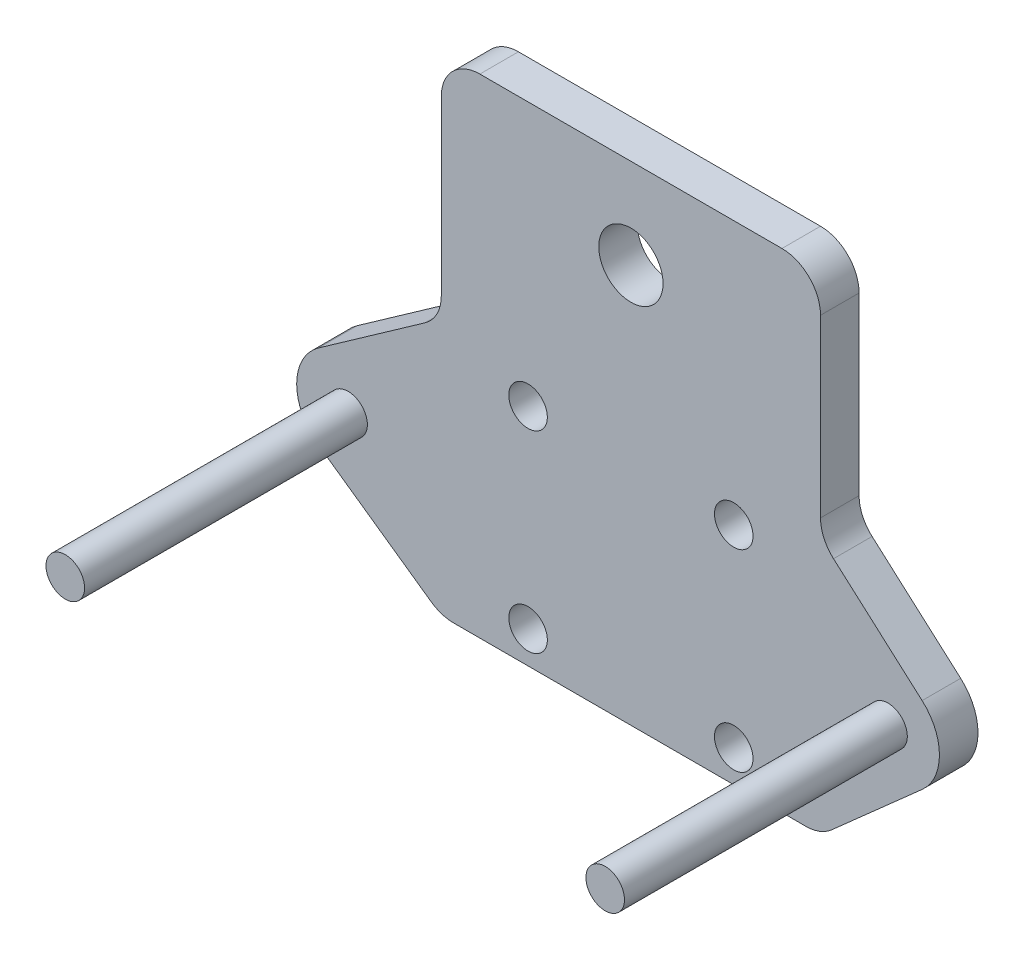
ISO-10303-21;
HEADER;
FILE_DESCRIPTION(('STEP AP214'),'2;1');
FILE_NAME('part.step','',(''),(''),'','','');
FILE_SCHEMA(('AUTOMOTIVE_DESIGN { 1 0 10303 214 1 1 1 1 }'));
ENDSEC;
DATA;
#1=APPLICATION_CONTEXT('core data for automotive mechanical design processes');
#2=APPLICATION_PROTOCOL_DEFINITION('international standard','automotive_design',2000,#1);
#3=PRODUCT_CONTEXT('',#1,'mechanical');
#4=PRODUCT('Part','Part','',(#3));
#5=PRODUCT_RELATED_PRODUCT_CATEGORY('part','',(#4));
#6=PRODUCT_DEFINITION_FORMATION('','',#4);
#7=PRODUCT_DEFINITION_CONTEXT('part definition',#1,'design');
#8=PRODUCT_DEFINITION('design','',#6,#7);
#9=PRODUCT_DEFINITION_SHAPE('','',#8);
#10=(LENGTH_UNIT() NAMED_UNIT(*) SI_UNIT(.MILLI.,.METRE.));
#11=(NAMED_UNIT(*) PLANE_ANGLE_UNIT() SI_UNIT($,.RADIAN.));
#12=(NAMED_UNIT(*) SI_UNIT($,.STERADIAN.) SOLID_ANGLE_UNIT());
#13=UNCERTAINTY_MEASURE_WITH_UNIT(LENGTH_MEASURE(1.E-05),#10,'distance_accuracy_value','');
#14=(GEOMETRIC_REPRESENTATION_CONTEXT(3) GLOBAL_UNCERTAINTY_ASSIGNED_CONTEXT((#13)) GLOBAL_UNIT_ASSIGNED_CONTEXT((#10,
#11,#12)) REPRESENTATION_CONTEXT('',''));
#15=CARTESIAN_POINT('',(0.,0.,0.));
#16=DIRECTION('',(0.,0.,1.));
#17=DIRECTION('',(1.,0.,0.));
#18=AXIS2_PLACEMENT_3D('',#15,#16,#17);
#19=CARTESIAN_POINT('',(20.,-21.,23.5));
#20=DIRECTION('',(0.,0.,-1.));
#21=DIRECTION('',(-1.,0.,0.));
#22=AXIS2_PLACEMENT_3D('',#19,#20,#21);
#23=CYLINDRICAL_SURFACE('',#22,1.5);
#24=CARTESIAN_POINT('',(20.,-21.,23.5));
#25=DIRECTION('',(0.,0.,-1.));
#26=DIRECTION('',(-1.,0.,0.));
#27=AXIS2_PLACEMENT_3D('',#24,#25,#26);
#28=CIRCLE('',#27,1.5);
#29=CARTESIAN_POINT('',(18.5,-21.,23.5));
#30=VERTEX_POINT('',#29);
#31=EDGE_CURVE('E11',#30,#30,#28,.T.);
#32=ORIENTED_EDGE('',*,*,#31,.T.);
#33=EDGE_LOOP('',(#32));
#34=FACE_BOUND('',#33,.T.);
#35=CARTESIAN_POINT('',(20.,-21.,-1.5));
#36=DIRECTION('',(0.,0.,-1.));
#37=DIRECTION('',(-1.,0.,0.));
#38=AXIS2_PLACEMENT_3D('',#35,#36,#37);
#39=CIRCLE('',#38,1.5);
#40=CARTESIAN_POINT('',(18.5,-21.,-1.5));
#41=VERTEX_POINT('',#40);
#42=EDGE_CURVE('E50',#41,#41,#39,.T.);
#43=ORIENTED_EDGE('',*,*,#42,.F.);
#44=EDGE_LOOP('',(#43));
#45=FACE_BOUND('',#44,.T.);
#46=ADVANCED_FACE('F47',(#34,#45),#23,.T.);
#47=CARTESIAN_POINT('',(20.,-21.,23.5));
#48=DIRECTION('',(0.,0.,-1.));
#49=DIRECTION('',(-1.,0.,0.));
#50=AXIS2_PLACEMENT_3D('',#47,#48,#49);
#51=PLANE('',#50);
#52=ORIENTED_EDGE('',*,*,#31,.F.);
#53=EDGE_LOOP('',(#52));
#54=FACE_BOUND('',#53,.T.);
#55=ADVANCED_FACE('F62',(#54),#51,.F.);
#56=CARTESIAN_POINT('',(20.,-21.,-1.5));
#57=DIRECTION('',(0.,0.,-1.));
#58=DIRECTION('',(-1.,0.,0.));
#59=AXIS2_PLACEMENT_3D('',#56,#57,#58);
#60=PLANE('',#59);
#61=ORIENTED_EDGE('',*,*,#42,.T.);
#62=EDGE_LOOP('',(#61));
#63=FACE_BOUND('',#62,.T.);
#64=ADVANCED_FACE('F59',(#63),#60,.T.);
#65=CLOSED_SHELL('',(#46,#55,#64));
#66=MANIFOLD_SOLID_BREP('B2',#65);
#67=CARTESIAN_POINT('',(-22.,-21.,23.5));
#68=DIRECTION('',(0.,0.,-1.));
#69=DIRECTION('',(-1.,0.,0.));
#70=AXIS2_PLACEMENT_3D('',#67,#68,#69);
#71=CYLINDRICAL_SURFACE('',#70,1.5);
#72=CARTESIAN_POINT('',(-22.,-21.,23.5));
#73=DIRECTION('',(0.,0.,-1.));
#74=DIRECTION('',(-1.,0.,0.));
#75=AXIS2_PLACEMENT_3D('',#72,#73,#74);
#76=CIRCLE('',#75,1.5);
#77=CARTESIAN_POINT('',(-23.5,-21.,23.5));
#78=VERTEX_POINT('',#77);
#79=EDGE_CURVE('E46',#78,#78,#76,.T.);
#80=ORIENTED_EDGE('',*,*,#79,.T.);
#81=EDGE_LOOP('',(#80));
#82=FACE_BOUND('',#81,.T.);
#83=CARTESIAN_POINT('',(-22.,-21.,-1.5));
#84=DIRECTION('',(0.,0.,-1.));
#85=DIRECTION('',(-1.,0.,0.));
#86=AXIS2_PLACEMENT_3D('',#83,#84,#85);
#87=CIRCLE('',#86,1.5);
#88=CARTESIAN_POINT('',(-23.5,-21.,-1.5));
#89=VERTEX_POINT('',#88);
#90=EDGE_CURVE('E99',#89,#89,#87,.T.);
#91=ORIENTED_EDGE('',*,*,#90,.F.);
#92=EDGE_LOOP('',(#91));
#93=FACE_BOUND('',#92,.T.);
#94=ADVANCED_FACE('F96',(#82,#93),#71,.T.);
#95=CARTESIAN_POINT('',(-22.,-21.,23.5));
#96=DIRECTION('',(0.,0.,-1.));
#97=DIRECTION('',(-1.,0.,0.));
#98=AXIS2_PLACEMENT_3D('',#95,#96,#97);
#99=PLANE('',#98);
#100=ORIENTED_EDGE('',*,*,#79,.F.);
#101=EDGE_LOOP('',(#100));
#102=FACE_BOUND('',#101,.T.);
#103=ADVANCED_FACE('F111',(#102),#99,.F.);
#104=CARTESIAN_POINT('',(-22.,-21.,-1.5));
#105=DIRECTION('',(0.,0.,-1.));
#106=DIRECTION('',(-1.,0.,0.));
#107=AXIS2_PLACEMENT_3D('',#104,#105,#106);
#108=PLANE('',#107);
#109=ORIENTED_EDGE('',*,*,#90,.T.);
#110=EDGE_LOOP('',(#109));
#111=FACE_BOUND('',#110,.T.);
#112=ADVANCED_FACE('F108',(#111),#108,.T.);
#113=CLOSED_SHELL('',(#94,#103,#112));
#114=MANIFOLD_SOLID_BREP('B6',#113);
#115=CARTESIAN_POINT('',(14.75,7.,1.5));
#116=DIRECTION('',(-1.,0.,0.));
#117=DIRECTION('',(0.,-1.,0.));
#118=AXIS2_PLACEMENT_3D('',#115,#116,#117);
#119=PLANE('',#118);
#120=DIRECTION('',(0.,1.,0.));
#121=VECTOR('',#120,1.);
#122=CARTESIAN_POINT('',(14.75,7.,-1.5));
#123=LINE('',#122,#121);
#124=CARTESIAN_POINT('',(14.75,-9.65044379086688,-1.5));
#125=VERTEX_POINT('',#124);
#126=CARTESIAN_POINT('',(14.75,4.,-1.5));
#127=VERTEX_POINT('',#126);
#128=EDGE_CURVE('E359',#125,#127,#123,.T.);
#129=ORIENTED_EDGE('',*,*,#128,.T.);
#130=DIRECTION('',(0.,0.,-1.));
#131=VECTOR('',#130,1.);
#132=CARTESIAN_POINT('',(14.75,4.,1.5));
#133=LINE('',#132,#131);
#134=CARTESIAN_POINT('',(14.75,4.,1.5));
#135=VERTEX_POINT('',#134);
#136=EDGE_CURVE('E378',#127,#135,#133,.F.);
#137=ORIENTED_EDGE('',*,*,#136,.T.);
#138=DIRECTION('',(0.,1.,0.));
#139=VECTOR('',#138,1.);
#140=CARTESIAN_POINT('',(14.75,7.,1.5));
#141=LINE('',#140,#139);
#142=CARTESIAN_POINT('',(14.75,-9.65044379086688,1.5));
#143=VERTEX_POINT('',#142);
#144=EDGE_CURVE('E348',#143,#135,#141,.T.);
#145=ORIENTED_EDGE('',*,*,#144,.F.);
#146=DIRECTION('',(0.,0.,1.));
#147=VECTOR('',#146,1.);
#148=CARTESIAN_POINT('',(14.75,-9.65044379086688,1.5));
#149=LINE('',#148,#147);
#150=EDGE_CURVE('E376',#143,#125,#149,.F.);
#151=ORIENTED_EDGE('',*,*,#150,.T.);
#152=EDGE_LOOP('',(#129,#137,#145,#151));
#153=FACE_BOUND('',#152,.T.);
#154=ADVANCED_FACE('F136',(#153),#119,.F.);
#155=CARTESIAN_POINT('',(0.,0.,1.5));
#156=DIRECTION('',(0.,0.,1.));
#157=DIRECTION('',(1.,0.,0.));
#158=AXIS2_PLACEMENT_3D('',#155,#156,#157);
#159=PLANE('',#158);
#160=CARTESIAN_POINT('',(8.,-28.5,1.5));
#161=DIRECTION('',(0.,0.,1.));
#162=DIRECTION('',(1.,0.,0.));
#163=AXIS2_PLACEMENT_3D('',#160,#161,#162);
#164=CIRCLE('',#163,1.5);
#165=CARTESIAN_POINT('',(9.50000000000001,-28.5,1.5));
#166=VERTEX_POINT('',#165);
#167=EDGE_CURVE('E318',#166,#166,#164,.T.);
#168=ORIENTED_EDGE('',*,*,#167,.F.);
#169=EDGE_LOOP('',(#168));
#170=FACE_BOUND('',#169,.T.);
#171=CARTESIAN_POINT('',(-7.99999999999999,-13.5,1.5));
#172=DIRECTION('',(0.,0.,1.));
#173=DIRECTION('',(1.,0.,0.));
#174=AXIS2_PLACEMENT_3D('',#171,#172,#173);
#175=CIRCLE('',#174,1.5);
#176=CARTESIAN_POINT('',(-6.5,-13.5,1.5));
#177=VERTEX_POINT('',#176);
#178=EDGE_CURVE('E330',#177,#177,#175,.T.);
#179=ORIENTED_EDGE('',*,*,#178,.F.);
#180=EDGE_LOOP('',(#179));
#181=FACE_BOUND('',#180,.T.);
#182=ORIENTED_EDGE('',*,*,#144,.T.);
#183=CARTESIAN_POINT('',(11.75,4.,1.5));
#184=DIRECTION('',(0.,0.,1.));
#185=DIRECTION('',(1.,0.,0.));
#186=AXIS2_PLACEMENT_3D('',#183,#184,#185);
#187=CIRCLE('',#186,3.);
#188=CARTESIAN_POINT('',(11.75,7.,1.5));
#189=VERTEX_POINT('',#188);
#190=EDGE_CURVE('E385',#135,#189,#187,.T.);
#191=ORIENTED_EDGE('',*,*,#190,.T.);
#192=DIRECTION('',(-1.,0.,0.));
#193=VECTOR('',#192,1.);
#194=CARTESIAN_POINT('',(-14.75,7.,1.5));
#195=LINE('',#194,#193);
#196=CARTESIAN_POINT('',(-11.75,7.,1.5));
#197=VERTEX_POINT('',#196);
#198=EDGE_CURVE('E350',#189,#197,#195,.T.);
#199=ORIENTED_EDGE('',*,*,#198,.T.);
#200=CARTESIAN_POINT('',(-11.75,4.,1.5));
#201=DIRECTION('',(0.,0.,1.));
#202=DIRECTION('',(1.,0.,0.));
#203=AXIS2_PLACEMENT_3D('',#200,#201,#202);
#204=CIRCLE('',#203,3.);
#205=CARTESIAN_POINT('',(-14.75,4.,1.5));
#206=VERTEX_POINT('',#205);
#207=EDGE_CURVE('E380',#197,#206,#204,.T.);
#208=ORIENTED_EDGE('',*,*,#207,.T.);
#209=DIRECTION('',(0.,-1.,0.));
#210=VECTOR('',#209,1.);
#211=CARTESIAN_POINT('',(-14.75,7.,1.5));
#212=LINE('',#211,#210);
#213=CARTESIAN_POINT('',(-14.75,-9.44369609921209,1.5));
#214=VERTEX_POINT('',#213);
#215=EDGE_CURVE('E342',#206,#214,#212,.T.);
#216=ORIENTED_EDGE('',*,*,#215,.T.);
#217=CARTESIAN_POINT('',(-17.75,-9.44369609921209,1.5));
#218=DIRECTION('',(0.,0.,1.));
#219=DIRECTION('',(1.,0.,0.));
#220=AXIS2_PLACEMENT_3D('',#217,#218,#219);
#221=CIRCLE('',#220,3.);
#222=CARTESIAN_POINT('',(-16.0223154328514,-11.8962674103948,1.5));
#223=VERTEX_POINT('',#222);
#224=EDGE_CURVE('E144',#214,#223,#221,.F.);
#225=ORIENTED_EDGE('',*,*,#224,.T.);
#226=DIRECTION('',(-0.817523770394244,-0.575894855716197,0.));
#227=VECTOR('',#226,1.);
#228=CARTESIAN_POINT('',(-24.3035794228648,-17.729904918423,1.5));
#229=LINE('',#228,#227);
#230=CARTESIAN_POINT('',(-24.3035794228648,-17.729904918423,1.5));
#231=VERTEX_POINT('',#230);
#232=EDGE_CURVE('E303',#223,#231,#229,.T.);
#233=ORIENTED_EDGE('',*,*,#232,.T.);
#234=CARTESIAN_POINT('',(-22.,-21.,1.5));
#235=DIRECTION('',(0.,0.,1.));
#236=DIRECTION('',(1.,0.,0.));
#237=AXIS2_PLACEMENT_3D('',#234,#235,#236);
#238=CIRCLE('',#237,4.);
#239=CARTESIAN_POINT('',(-24.3035794228648,-24.270095081577,1.5));
#240=VERTEX_POINT('',#239);
#241=EDGE_CURVE('E297',#231,#240,#238,.T.);
#242=ORIENTED_EDGE('',*,*,#241,.T.);
#243=DIRECTION('',(0.817523770394244,-0.575894855716198,0.));
#244=VECTOR('',#243,1.);
#245=CARTESIAN_POINT('',(-24.3035794228648,-24.270095081577,1.5));
#246=LINE('',#245,#244);
#247=CARTESIAN_POINT('',(-15.5271140187514,-30.4525713111827,1.5));
#248=VERTEX_POINT('',#247);
#249=EDGE_CURVE('E300',#240,#248,#246,.T.);
#250=ORIENTED_EDGE('',*,*,#249,.T.);
#251=CARTESIAN_POINT('',(-13.7994294516028,-28.,1.5));
#252=DIRECTION('',(0.,0.,1.));
#253=DIRECTION('',(1.,0.,0.));
#254=AXIS2_PLACEMENT_3D('',#251,#252,#253);
#255=CIRCLE('',#254,3.);
#256=CARTESIAN_POINT('',(-13.7994294516028,-31.,1.5));
#257=VERTEX_POINT('',#256);
#258=EDGE_CURVE('E382',#248,#257,#255,.T.);
#259=ORIENTED_EDGE('',*,*,#258,.T.);
#260=DIRECTION('',(1.,0.,0.));
#261=VECTOR('',#260,1.);
#262=CARTESIAN_POINT('',(-14.75,-31.,1.5));
#263=LINE('',#262,#261);
#264=CARTESIAN_POINT('',(13.6116467670417,-31.,1.5));
#265=VERTEX_POINT('',#264);
#266=EDGE_CURVE('E345',#257,#265,#263,.T.);
#267=ORIENTED_EDGE('',*,*,#266,.T.);
#268=CARTESIAN_POINT('',(13.6116467670417,-28.,1.5));
#269=DIRECTION('',(0.,0.,1.));
#270=DIRECTION('',(1.,0.,0.));
#271=AXIS2_PLACEMENT_3D('',#268,#269,#270);
#272=CIRCLE('',#271,3.);
#273=CARTESIAN_POINT('',(15.6018041613712,-30.244832632023,1.5));
#274=VERTEX_POINT('',#273);
#275=EDGE_CURVE('E159',#265,#274,#272,.T.);
#276=ORIENTED_EDGE('',*,*,#275,.T.);
#277=DIRECTION('',(0.748277544007673,0.663385798109852,0.));
#278=VECTOR('',#277,1.);
#279=CARTESIAN_POINT('',(22.6535431924394,-23.9931101760307,1.5));
#280=LINE('',#279,#278);
#281=CARTESIAN_POINT('',(22.6535431924394,-23.9931101760307,1.5));
#282=VERTEX_POINT('',#281);
#283=EDGE_CURVE('E261',#274,#282,#280,.T.);
#284=ORIENTED_EDGE('',*,*,#283,.T.);
#285=CARTESIAN_POINT('',(20.,-21.,1.5));
#286=DIRECTION('',(0.,0.,1.));
#287=DIRECTION('',(1.,0.,0.));
#288=AXIS2_PLACEMENT_3D('',#285,#286,#287);
#289=CIRCLE('',#288,4.);
#290=CARTESIAN_POINT('',(22.6535431924394,-18.0068898239693,1.5));
#291=VERTEX_POINT('',#290);
#292=EDGE_CURVE('E256',#282,#291,#289,.T.);
#293=ORIENTED_EDGE('',*,*,#292,.T.);
#294=DIRECTION('',(-0.748277544007673,0.663385798109852,0.));
#295=VECTOR('',#294,1.);
#296=CARTESIAN_POINT('',(22.6535431924394,-18.0068898239693,1.5));
#297=LINE('',#296,#295);
#298=CARTESIAN_POINT('',(15.7598426056704,-11.8952764228899,1.5));
#299=VERTEX_POINT('',#298);
#300=EDGE_CURVE('E264',#291,#299,#297,.T.);
#301=ORIENTED_EDGE('',*,*,#300,.T.);
#302=CARTESIAN_POINT('',(17.75,-9.65044379086688,1.5));
#303=DIRECTION('',(0.,0.,1.));
#304=DIRECTION('',(1.,0.,0.));
#305=AXIS2_PLACEMENT_3D('',#302,#303,#304);
#306=CIRCLE('',#305,3.);
#307=EDGE_CURVE('E151',#299,#143,#306,.F.);
#308=ORIENTED_EDGE('',*,*,#307,.T.);
#309=EDGE_LOOP('',(#182,#191,#199,#208,#216,#225,#233,#242,#250,#259,#267,#276,#284,#293,#301,#308));
#310=FACE_BOUND('',#309,.T.);
#311=CARTESIAN_POINT('',(0.,0.,1.5));
#312=DIRECTION('',(0.,0.,1.));
#313=DIRECTION('',(1.,0.,0.));
#314=AXIS2_PLACEMENT_3D('',#311,#312,#313);
#315=CIRCLE('',#314,2.5);
#316=CARTESIAN_POINT('',(2.5,0.,1.5));
#317=VERTEX_POINT('',#316);
#318=EDGE_CURVE('E336',#317,#317,#315,.T.);
#319=ORIENTED_EDGE('',*,*,#318,.F.);
#320=EDGE_LOOP('',(#319));
#321=FACE_BOUND('',#320,.T.);
#322=CARTESIAN_POINT('',(8.00000000000001,-13.5,1.5));
#323=DIRECTION('',(0.,0.,1.));
#324=DIRECTION('',(1.,0.,0.));
#325=AXIS2_PLACEMENT_3D('',#322,#323,#324);
#326=CIRCLE('',#325,1.5);
#327=CARTESIAN_POINT('',(9.50000000000001,-13.5,1.5));
#328=VERTEX_POINT('',#327);
#329=EDGE_CURVE('E324',#328,#328,#326,.T.);
#330=ORIENTED_EDGE('',*,*,#329,.F.);
#331=EDGE_LOOP('',(#330));
#332=FACE_BOUND('',#331,.T.);
#333=CARTESIAN_POINT('',(-8.,-28.5,1.5));
#334=DIRECTION('',(0.,0.,1.));
#335=DIRECTION('',(1.,0.,0.));
#336=AXIS2_PLACEMENT_3D('',#333,#334,#335);
#337=CIRCLE('',#336,1.5);
#338=CARTESIAN_POINT('',(-6.5,-28.5,1.5));
#339=VERTEX_POINT('',#338);
#340=EDGE_CURVE('E312',#339,#339,#337,.T.);
#341=ORIENTED_EDGE('',*,*,#340,.F.);
#342=EDGE_LOOP('',(#341));
#343=FACE_BOUND('',#342,.T.);
#344=CARTESIAN_POINT('',(-22.,-21.,1.5));
#345=DIRECTION('',(0.,0.,1.));
#346=DIRECTION('',(1.,0.,0.));
#347=AXIS2_PLACEMENT_3D('',#344,#345,#346);
#348=CIRCLE('',#347,1.5);
#349=CARTESIAN_POINT('',(-20.5,-21.,1.5));
#350=VERTEX_POINT('',#349);
#351=EDGE_CURVE('E284',#350,#350,#348,.T.);
#352=ORIENTED_EDGE('',*,*,#351,.F.);
#353=EDGE_LOOP('',(#352));
#354=FACE_BOUND('',#353,.T.);
#355=CARTESIAN_POINT('',(20.,-21.,1.5));
#356=DIRECTION('',(0.,0.,1.));
#357=DIRECTION('',(1.,0.,0.));
#358=AXIS2_PLACEMENT_3D('',#355,#356,#357);
#359=CIRCLE('',#358,1.5);
#360=CARTESIAN_POINT('',(21.5,-21.,1.5));
#361=VERTEX_POINT('',#360);
#362=EDGE_CURVE('E272',#361,#361,#359,.T.);
#363=ORIENTED_EDGE('',*,*,#362,.F.);
#364=EDGE_LOOP('',(#363));
#365=FACE_BOUND('',#364,.T.);
#366=ADVANCED_FACE('F269',(#170,#181,#310,#321,#332,#343,#354,#365),#159,.T.);
#367=CARTESIAN_POINT('',(0.,0.,-1.5));
#368=DIRECTION('',(0.,0.,1.));
#369=DIRECTION('',(1.,0.,0.));
#370=AXIS2_PLACEMENT_3D('',#367,#368,#369);
#371=PLANE('',#370);
#372=DIRECTION('',(-1.,0.,0.));
#373=VECTOR('',#372,1.);
#374=CARTESIAN_POINT('',(-14.75,7.,-1.5));
#375=LINE('',#374,#373);
#376=CARTESIAN_POINT('',(11.75,7.,-1.5));
#377=VERTEX_POINT('',#376);
#378=CARTESIAN_POINT('',(-11.75,7.,-1.5));
#379=VERTEX_POINT('',#378);
#380=EDGE_CURVE('E346',#377,#379,#375,.T.);
#381=ORIENTED_EDGE('',*,*,#380,.F.);
#382=CARTESIAN_POINT('',(11.75,4.,-1.5));
#383=DIRECTION('',(0.,0.,1.));
#384=DIRECTION('',(1.,0.,0.));
#385=AXIS2_PLACEMENT_3D('',#382,#383,#384);
#386=CIRCLE('',#385,3.);
#387=EDGE_CURVE('E374',#377,#127,#386,.F.);
#388=ORIENTED_EDGE('',*,*,#387,.T.);
#389=ORIENTED_EDGE('',*,*,#128,.F.);
#390=CARTESIAN_POINT('',(17.75,-9.65044379086688,-1.5));
#391=DIRECTION('',(0.,0.,1.));
#392=DIRECTION('',(1.,0.,0.));
#393=AXIS2_PLACEMENT_3D('',#390,#391,#392);
#394=CIRCLE('',#393,3.);
#395=CARTESIAN_POINT('',(15.7598426056704,-11.8952764228899,-1.5));
#396=VERTEX_POINT('',#395);
#397=EDGE_CURVE('E407',#125,#396,#394,.T.);
#398=ORIENTED_EDGE('',*,*,#397,.T.);
#399=DIRECTION('',(0.748277544007673,-0.663385798109852,0.));
#400=VECTOR('',#399,1.);
#401=CARTESIAN_POINT('',(22.6535431924394,-18.0068898239693,-1.5));
#402=LINE('',#401,#400);
#403=CARTESIAN_POINT('',(22.6535431924394,-18.0068898239693,-1.5));
#404=VERTEX_POINT('',#403);
#405=EDGE_CURVE('E285',#396,#404,#402,.T.);
#406=ORIENTED_EDGE('',*,*,#405,.T.);
#407=CARTESIAN_POINT('',(20.,-21.,-1.5));
#408=DIRECTION('',(0.,0.,1.));
#409=DIRECTION('',(1.,0.,0.));
#410=AXIS2_PLACEMENT_3D('',#407,#408,#409);
#411=CIRCLE('',#410,4.);
#412=CARTESIAN_POINT('',(22.6535431924394,-23.9931101760307,-1.5));
#413=VERTEX_POINT('',#412);
#414=EDGE_CURVE('E257',#404,#413,#411,.F.);
#415=ORIENTED_EDGE('',*,*,#414,.T.);
#416=DIRECTION('',(-0.748277544007673,-0.663385798109852,0.));
#417=VECTOR('',#416,1.);
#418=CARTESIAN_POINT('',(22.6535431924394,-23.9931101760307,-1.5));
#419=LINE('',#418,#417);
#420=CARTESIAN_POINT('',(15.6018041613712,-30.244832632023,-1.5));
#421=VERTEX_POINT('',#420);
#422=EDGE_CURVE('E279',#413,#421,#419,.T.);
#423=ORIENTED_EDGE('',*,*,#422,.T.);
#424=CARTESIAN_POINT('',(13.6116467670417,-28.,-1.5));
#425=DIRECTION('',(0.,0.,1.));
#426=DIRECTION('',(1.,0.,0.));
#427=AXIS2_PLACEMENT_3D('',#424,#425,#426);
#428=CIRCLE('',#427,3.);
#429=CARTESIAN_POINT('',(13.6116467670417,-31.,-1.5));
#430=VERTEX_POINT('',#429);
#431=EDGE_CURVE('E372',#421,#430,#428,.F.);
#432=ORIENTED_EDGE('',*,*,#431,.T.);
#433=DIRECTION('',(1.,0.,0.));
#434=VECTOR('',#433,1.);
#435=CARTESIAN_POINT('',(-14.75,-31.,-1.5));
#436=LINE('',#435,#434);
#437=CARTESIAN_POINT('',(-13.7994294516028,-31.,-1.5));
#438=VERTEX_POINT('',#437);
#439=EDGE_CURVE('E356',#438,#430,#436,.T.);
#440=ORIENTED_EDGE('',*,*,#439,.F.);
#441=CARTESIAN_POINT('',(-13.7994294516028,-28.,-1.5));
#442=DIRECTION('',(0.,0.,1.));
#443=DIRECTION('',(1.,0.,0.));
#444=AXIS2_PLACEMENT_3D('',#441,#442,#443);
#445=CIRCLE('',#444,3.);
#446=CARTESIAN_POINT('',(-15.5271140187514,-30.4525713111827,-1.5));
#447=VERTEX_POINT('',#446);
#448=EDGE_CURVE('E370',#438,#447,#445,.F.);
#449=ORIENTED_EDGE('',*,*,#448,.T.);
#450=DIRECTION('',(-0.817523770394244,0.575894855716198,0.));
#451=VECTOR('',#450,1.);
#452=CARTESIAN_POINT('',(-24.3035794228648,-24.270095081577,-1.5));
#453=LINE('',#452,#451);
#454=CARTESIAN_POINT('',(-24.3035794228648,-24.270095081577,-1.5));
#455=VERTEX_POINT('',#454);
#456=EDGE_CURVE('E286',#447,#455,#453,.T.);
#457=ORIENTED_EDGE('',*,*,#456,.T.);
#458=CARTESIAN_POINT('',(-22.,-21.,-1.5));
#459=DIRECTION('',(0.,0.,1.));
#460=DIRECTION('',(1.,0.,0.));
#461=AXIS2_PLACEMENT_3D('',#458,#459,#460);
#462=CIRCLE('',#461,4.);
#463=CARTESIAN_POINT('',(-24.3035794228648,-17.729904918423,-1.5));
#464=VERTEX_POINT('',#463);
#465=EDGE_CURVE('E289',#455,#464,#462,.F.);
#466=ORIENTED_EDGE('',*,*,#465,.T.);
#467=DIRECTION('',(0.817523770394244,0.575894855716197,0.));
#468=VECTOR('',#467,1.);
#469=CARTESIAN_POINT('',(-24.3035794228648,-17.729904918423,-1.5));
#470=LINE('',#469,#468);
#471=CARTESIAN_POINT('',(-16.0223154328514,-11.8962674103948,-1.5));
#472=VERTEX_POINT('',#471);
#473=EDGE_CURVE('E290',#464,#472,#470,.T.);
#474=ORIENTED_EDGE('',*,*,#473,.T.);
#475=CARTESIAN_POINT('',(-17.75,-9.44369609921209,-1.5));
#476=DIRECTION('',(0.,0.,1.));
#477=DIRECTION('',(1.,0.,0.));
#478=AXIS2_PLACEMENT_3D('',#475,#476,#477);
#479=CIRCLE('',#478,3.);
#480=CARTESIAN_POINT('',(-14.75,-9.44369609921209,-1.5));
#481=VERTEX_POINT('',#480);
#482=EDGE_CURVE('E94',#472,#481,#479,.T.);
#483=ORIENTED_EDGE('',*,*,#482,.T.);
#484=DIRECTION('',(0.,-1.,0.));
#485=VECTOR('',#484,1.);
#486=CARTESIAN_POINT('',(-14.75,7.,-1.5));
#487=LINE('',#486,#485);
#488=CARTESIAN_POINT('',(-14.75,4.,-1.5));
#489=VERTEX_POINT('',#488);
#490=EDGE_CURVE('E339',#489,#481,#487,.T.);
#491=ORIENTED_EDGE('',*,*,#490,.F.);
#492=CARTESIAN_POINT('',(-11.75,4.,-1.5));
#493=DIRECTION('',(0.,0.,1.));
#494=DIRECTION('',(1.,0.,0.));
#495=AXIS2_PLACEMENT_3D('',#492,#493,#494);
#496=CIRCLE('',#495,3.);
#497=EDGE_CURVE('E368',#489,#379,#496,.F.);
#498=ORIENTED_EDGE('',*,*,#497,.T.);
#499=EDGE_LOOP('',(#381,#388,#389,#398,#406,#415,#423,#432,#440,#449,#457,#466,#474,#483,#491,#498));
#500=FACE_BOUND('',#499,.T.);
#501=CARTESIAN_POINT('',(0.,0.,-1.5));
#502=DIRECTION('',(0.,0.,1.));
#503=DIRECTION('',(1.,0.,0.));
#504=AXIS2_PLACEMENT_3D('',#501,#502,#503);
#505=CIRCLE('',#504,2.5);
#506=CARTESIAN_POINT('',(2.5,0.,-1.5));
#507=VERTEX_POINT('',#506);
#508=EDGE_CURVE('E333',#507,#507,#505,.T.);
#509=ORIENTED_EDGE('',*,*,#508,.T.);
#510=EDGE_LOOP('',(#509));
#511=FACE_BOUND('',#510,.T.);
#512=CARTESIAN_POINT('',(-7.99999999999999,-13.5,-1.5));
#513=DIRECTION('',(0.,0.,1.));
#514=DIRECTION('',(1.,0.,0.));
#515=AXIS2_PLACEMENT_3D('',#512,#513,#514);
#516=CIRCLE('',#515,1.5);
#517=CARTESIAN_POINT('',(-6.5,-13.5,-1.5));
#518=VERTEX_POINT('',#517);
#519=EDGE_CURVE('E327',#518,#518,#516,.T.);
#520=ORIENTED_EDGE('',*,*,#519,.T.);
#521=EDGE_LOOP('',(#520));
#522=FACE_BOUND('',#521,.T.);
#523=CARTESIAN_POINT('',(8.00000000000001,-13.5,-1.5));
#524=DIRECTION('',(0.,0.,1.));
#525=DIRECTION('',(1.,0.,0.));
#526=AXIS2_PLACEMENT_3D('',#523,#524,#525);
#527=CIRCLE('',#526,1.5);
#528=CARTESIAN_POINT('',(9.50000000000001,-13.5,-1.5));
#529=VERTEX_POINT('',#528);
#530=EDGE_CURVE('E321',#529,#529,#527,.T.);
#531=ORIENTED_EDGE('',*,*,#530,.T.);
#532=EDGE_LOOP('',(#531));
#533=FACE_BOUND('',#532,.T.);
#534=CARTESIAN_POINT('',(8.,-28.5,-1.5));
#535=DIRECTION('',(0.,0.,1.));
#536=DIRECTION('',(1.,0.,0.));
#537=AXIS2_PLACEMENT_3D('',#534,#535,#536);
#538=CIRCLE('',#537,1.5);
#539=CARTESIAN_POINT('',(9.50000000000001,-28.5,-1.5));
#540=VERTEX_POINT('',#539);
#541=EDGE_CURVE('E315',#540,#540,#538,.T.);
#542=ORIENTED_EDGE('',*,*,#541,.T.);
#543=EDGE_LOOP('',(#542));
#544=FACE_BOUND('',#543,.T.);
#545=CARTESIAN_POINT('',(-8.,-28.5,-1.5));
#546=DIRECTION('',(0.,0.,1.));
#547=DIRECTION('',(1.,0.,0.));
#548=AXIS2_PLACEMENT_3D('',#545,#546,#547);
#549=CIRCLE('',#548,1.5);
#550=CARTESIAN_POINT('',(-6.5,-28.5,-1.5));
#551=VERTEX_POINT('',#550);
#552=EDGE_CURVE('E311',#551,#551,#549,.T.);
#553=ORIENTED_EDGE('',*,*,#552,.T.);
#554=EDGE_LOOP('',(#553));
#555=FACE_BOUND('',#554,.T.);
#556=CARTESIAN_POINT('',(-22.,-21.,-1.5));
#557=DIRECTION('',(0.,0.,1.));
#558=DIRECTION('',(1.,0.,0.));
#559=AXIS2_PLACEMENT_3D('',#556,#557,#558);
#560=CIRCLE('',#559,1.5);
#561=CARTESIAN_POINT('',(-20.5,-21.,-1.5));
#562=VERTEX_POINT('',#561);
#563=EDGE_CURVE('E288',#562,#562,#560,.F.);
#564=ORIENTED_EDGE('',*,*,#563,.F.);
#565=EDGE_LOOP('',(#564));
#566=FACE_BOUND('',#565,.T.);
#567=CARTESIAN_POINT('',(20.,-21.,-1.5));
#568=DIRECTION('',(0.,0.,1.));
#569=DIRECTION('',(1.,0.,0.));
#570=AXIS2_PLACEMENT_3D('',#567,#568,#569);
#571=CIRCLE('',#570,1.5);
#572=CARTESIAN_POINT('',(21.5,-21.,-1.5));
#573=VERTEX_POINT('',#572);
#574=EDGE_CURVE('E281',#573,#573,#571,.F.);
#575=ORIENTED_EDGE('',*,*,#574,.F.);
#576=EDGE_LOOP('',(#575));
#577=FACE_BOUND('',#576,.T.);
#578=ADVANCED_FACE('F423',(#500,#511,#522,#533,#544,#555,#566,#577),#371,.F.);
#579=CARTESIAN_POINT('',(-14.75,7.,1.5));
#580=DIRECTION('',(1.,0.,0.));
#581=DIRECTION('',(0.,1.,0.));
#582=AXIS2_PLACEMENT_3D('',#579,#580,#581);
#583=PLANE('',#582);
#584=ORIENTED_EDGE('',*,*,#490,.T.);
#585=DIRECTION('',(0.,0.,1.));
#586=VECTOR('',#585,1.);
#587=CARTESIAN_POINT('',(-14.75,-9.44369609921209,1.5));
#588=LINE('',#587,#586);
#589=EDGE_CURVE('E401',#481,#214,#588,.T.);
#590=ORIENTED_EDGE('',*,*,#589,.T.);
#591=ORIENTED_EDGE('',*,*,#215,.F.);
#592=DIRECTION('',(0.,0.,-1.));
#593=VECTOR('',#592,1.);
#594=CARTESIAN_POINT('',(-14.75,4.,1.5));
#595=LINE('',#594,#593);
#596=EDGE_CURVE('E398',#206,#489,#595,.T.);
#597=ORIENTED_EDGE('',*,*,#596,.T.);
#598=EDGE_LOOP('',(#584,#590,#591,#597));
#599=FACE_BOUND('',#598,.T.);
#600=ADVANCED_FACE('F426',(#599),#583,.F.);
#601=CARTESIAN_POINT('',(-14.75,-31.,1.5));
#602=DIRECTION('',(0.,1.,0.));
#603=DIRECTION('',(-1.,0.,0.));
#604=AXIS2_PLACEMENT_3D('',#601,#602,#603);
#605=PLANE('',#604);
#606=ORIENTED_EDGE('',*,*,#439,.T.);
#607=DIRECTION('',(0.,0.,-1.));
#608=VECTOR('',#607,1.);
#609=CARTESIAN_POINT('',(13.6116467670417,-31.,1.5));
#610=LINE('',#609,#608);
#611=EDGE_CURVE('E394',#430,#265,#610,.F.);
#612=ORIENTED_EDGE('',*,*,#611,.T.);
#613=ORIENTED_EDGE('',*,*,#266,.F.);
#614=DIRECTION('',(0.,0.,-1.));
#615=VECTOR('',#614,1.);
#616=CARTESIAN_POINT('',(-13.7994294516028,-31.,-1.5));
#617=LINE('',#616,#615);
#618=EDGE_CURVE('E391',#257,#438,#617,.T.);
#619=ORIENTED_EDGE('',*,*,#618,.T.);
#620=EDGE_LOOP('',(#606,#612,#613,#619));
#621=FACE_BOUND('',#620,.T.);
#622=ADVANCED_FACE('F457',(#621),#605,.F.);
#623=CARTESIAN_POINT('',(-14.75,7.,1.5));
#624=DIRECTION('',(0.,-1.,0.));
#625=DIRECTION('',(1.,0.,0.));
#626=AXIS2_PLACEMENT_3D('',#623,#624,#625);
#627=PLANE('',#626);
#628=ORIENTED_EDGE('',*,*,#198,.F.);
#629=DIRECTION('',(0.,0.,-1.));
#630=VECTOR('',#629,1.);
#631=CARTESIAN_POINT('',(11.75,7.,1.5));
#632=LINE('',#631,#630);
#633=EDGE_CURVE('E365',#189,#377,#632,.T.);
#634=ORIENTED_EDGE('',*,*,#633,.T.);
#635=ORIENTED_EDGE('',*,*,#380,.T.);
#636=DIRECTION('',(0.,0.,-1.));
#637=VECTOR('',#636,1.);
#638=CARTESIAN_POINT('',(-11.75,7.,1.5));
#639=LINE('',#638,#637);
#640=EDGE_CURVE('E353',#379,#197,#639,.F.);
#641=ORIENTED_EDGE('',*,*,#640,.T.);
#642=EDGE_LOOP('',(#628,#634,#635,#641));
#643=FACE_BOUND('',#642,.T.);
#644=ADVANCED_FACE('F433',(#643),#627,.F.);
#645=CARTESIAN_POINT('',(0.,0.,1.5));
#646=DIRECTION('',(0.,0.,-1.));
#647=DIRECTION('',(-1.,0.,0.));
#648=AXIS2_PLACEMENT_3D('',#645,#646,#647);
#649=CYLINDRICAL_SURFACE('',#648,2.5);
#650=ORIENTED_EDGE('',*,*,#318,.T.);
#651=EDGE_LOOP('',(#650));
#652=FACE_BOUND('',#651,.T.);
#653=ORIENTED_EDGE('',*,*,#508,.F.);
#654=EDGE_LOOP('',(#653));
#655=FACE_BOUND('',#654,.T.);
#656=ADVANCED_FACE('F586',(#652,#655),#649,.F.);
#657=CARTESIAN_POINT('',(-7.99999999999999,-13.5,1.5));
#658=DIRECTION('',(0.,0.,-1.));
#659=DIRECTION('',(-1.,0.,0.));
#660=AXIS2_PLACEMENT_3D('',#657,#658,#659);
#661=CYLINDRICAL_SURFACE('',#660,1.5);
#662=ORIENTED_EDGE('',*,*,#178,.T.);
#663=EDGE_LOOP('',(#662));
#664=FACE_BOUND('',#663,.T.);
#665=ORIENTED_EDGE('',*,*,#519,.F.);
#666=EDGE_LOOP('',(#665));
#667=FACE_BOUND('',#666,.T.);
#668=ADVANCED_FACE('F666',(#664,#667),#661,.F.);
#669=CARTESIAN_POINT('',(8.00000000000001,-13.5,1.5));
#670=DIRECTION('',(0.,0.,-1.));
#671=DIRECTION('',(-1.,0.,0.));
#672=AXIS2_PLACEMENT_3D('',#669,#670,#671);
#673=CYLINDRICAL_SURFACE('',#672,1.5);
#674=ORIENTED_EDGE('',*,*,#329,.T.);
#675=EDGE_LOOP('',(#674));
#676=FACE_BOUND('',#675,.T.);
#677=ORIENTED_EDGE('',*,*,#530,.F.);
#678=EDGE_LOOP('',(#677));
#679=FACE_BOUND('',#678,.T.);
#680=ADVANCED_FACE('F656',(#676,#679),#673,.F.);
#681=CARTESIAN_POINT('',(8.,-28.5,1.5));
#682=DIRECTION('',(0.,0.,-1.));
#683=DIRECTION('',(-1.,0.,0.));
#684=AXIS2_PLACEMENT_3D('',#681,#682,#683);
#685=CYLINDRICAL_SURFACE('',#684,1.5);
#686=ORIENTED_EDGE('',*,*,#167,.T.);
#687=EDGE_LOOP('',(#686));
#688=FACE_BOUND('',#687,.T.);
#689=ORIENTED_EDGE('',*,*,#541,.F.);
#690=EDGE_LOOP('',(#689));
#691=FACE_BOUND('',#690,.T.);
#692=ADVANCED_FACE('F647',(#688,#691),#685,.F.);
#693=CARTESIAN_POINT('',(-8.,-28.5,1.5));
#694=DIRECTION('',(0.,0.,-1.));
#695=DIRECTION('',(-1.,0.,0.));
#696=AXIS2_PLACEMENT_3D('',#693,#694,#695);
#697=CYLINDRICAL_SURFACE('',#696,1.5);
#698=ORIENTED_EDGE('',*,*,#340,.T.);
#699=EDGE_LOOP('',(#698));
#700=FACE_BOUND('',#699,.T.);
#701=ORIENTED_EDGE('',*,*,#552,.F.);
#702=EDGE_LOOP('',(#701));
#703=FACE_BOUND('',#702,.T.);
#704=ADVANCED_FACE('F576',(#700,#703),#697,.F.);
#705=CARTESIAN_POINT('',(-24.3035794228648,-24.270095081577,-24.4469496883573));
#706=DIRECTION('',(-0.575894855716198,-0.817523770394244,0.));
#707=DIRECTION('',(0.817523770394244,-0.575894855716198,0.));
#708=AXIS2_PLACEMENT_3D('',#705,#706,#707);
#709=PLANE('',#708);
#710=ORIENTED_EDGE('',*,*,#456,.F.);
#711=DIRECTION('',(0.,0.,-1.));
#712=VECTOR('',#711,1.);
#713=CARTESIAN_POINT('',(-15.5271140187514,-30.4525713111827,1.5));
#714=LINE('',#713,#712);
#715=EDGE_CURVE('E396',#447,#248,#714,.F.);
#716=ORIENTED_EDGE('',*,*,#715,.T.);
#717=ORIENTED_EDGE('',*,*,#249,.F.);
#718=DIRECTION('',(0.,0.,1.));
#719=VECTOR('',#718,1.);
#720=CARTESIAN_POINT('',(-24.3035794228648,-24.270095081577,-24.4469496883573));
#721=LINE('',#720,#719);
#722=EDGE_CURVE('E305',#455,#240,#721,.T.);
#723=ORIENTED_EDGE('',*,*,#722,.F.);
#724=EDGE_LOOP('',(#710,#716,#717,#723));
#725=FACE_BOUND('',#724,.T.);
#726=ADVANCED_FACE('F468',(#725),#709,.T.);
#727=CARTESIAN_POINT('',(-24.3035794228648,-17.729904918423,-24.4469496883573));
#728=DIRECTION('',(-0.575894855716197,0.817523770394244,0.));
#729=DIRECTION('',(-0.817523770394244,-0.575894855716197,0.));
#730=AXIS2_PLACEMENT_3D('',#727,#728,#729);
#731=PLANE('',#730);
#732=ORIENTED_EDGE('',*,*,#232,.F.);
#733=DIRECTION('',(0.,0.,1.));
#734=VECTOR('',#733,1.);
#735=CARTESIAN_POINT('',(-16.0223154328514,-11.8962674103948,-24.4469496883573));
#736=LINE('',#735,#734);
#737=EDGE_CURVE('E404',#223,#472,#736,.F.);
#738=ORIENTED_EDGE('',*,*,#737,.T.);
#739=ORIENTED_EDGE('',*,*,#473,.F.);
#740=DIRECTION('',(0.,0.,1.));
#741=VECTOR('',#740,1.);
#742=CARTESIAN_POINT('',(-24.3035794228648,-17.729904918423,-24.4469496883573));
#743=LINE('',#742,#741);
#744=EDGE_CURVE('E293',#464,#231,#743,.T.);
#745=ORIENTED_EDGE('',*,*,#744,.T.);
#746=EDGE_LOOP('',(#732,#738,#739,#745));
#747=FACE_BOUND('',#746,.T.);
#748=ADVANCED_FACE('F414',(#747),#731,.T.);
#749=CARTESIAN_POINT('',(-22.,-21.,-24.4469496883573));
#750=DIRECTION('',(0.,0.,1.));
#751=DIRECTION('',(1.,0.,0.));
#752=AXIS2_PLACEMENT_3D('',#749,#750,#751);
#753=CYLINDRICAL_SURFACE('',#752,4.);
#754=ORIENTED_EDGE('',*,*,#465,.F.);
#755=ORIENTED_EDGE('',*,*,#722,.T.);
#756=ORIENTED_EDGE('',*,*,#241,.F.);
#757=ORIENTED_EDGE('',*,*,#744,.F.);
#758=EDGE_LOOP('',(#754,#755,#756,#757));
#759=FACE_BOUND('',#758,.T.);
#760=ADVANCED_FACE('F470',(#759),#753,.T.);
#761=CARTESIAN_POINT('',(-22.,-21.,-24.4469496883573));
#762=DIRECTION('',(0.,0.,1.));
#763=DIRECTION('',(1.,0.,0.));
#764=AXIS2_PLACEMENT_3D('',#761,#762,#763);
#765=CYLINDRICAL_SURFACE('',#764,1.5);
#766=ORIENTED_EDGE('',*,*,#563,.T.);
#767=EDGE_LOOP('',(#766));
#768=FACE_BOUND('',#767,.T.);
#769=ORIENTED_EDGE('',*,*,#351,.T.);
#770=EDGE_LOOP('',(#769));
#771=FACE_BOUND('',#770,.T.);
#772=ADVANCED_FACE('F472',(#768,#771),#765,.F.);
#773=CARTESIAN_POINT('',(22.6535431924394,-18.0068898239693,-24.4469496883573));
#774=DIRECTION('',(0.663385798109852,0.748277544007673,0.));
#775=DIRECTION('',(-0.748277544007673,0.663385798109852,0.));
#776=AXIS2_PLACEMENT_3D('',#773,#774,#775);
#777=PLANE('',#776);
#778=ORIENTED_EDGE('',*,*,#405,.F.);
#779=DIRECTION('',(0.,0.,1.));
#780=VECTOR('',#779,1.);
#781=CARTESIAN_POINT('',(15.7598426056704,-11.8952764228899,-24.4469496883573));
#782=LINE('',#781,#780);
#783=EDGE_CURVE('E266',#396,#299,#782,.T.);
#784=ORIENTED_EDGE('',*,*,#783,.T.);
#785=ORIENTED_EDGE('',*,*,#300,.F.);
#786=DIRECTION('',(0.,0.,1.));
#787=VECTOR('',#786,1.);
#788=CARTESIAN_POINT('',(22.6535431924394,-18.0068898239693,-24.4469496883573));
#789=LINE('',#788,#787);
#790=EDGE_CURVE('E251',#404,#291,#789,.T.);
#791=ORIENTED_EDGE('',*,*,#790,.F.);
#792=EDGE_LOOP('',(#778,#784,#785,#791));
#793=FACE_BOUND('',#792,.T.);
#794=ADVANCED_FACE('F265',(#793),#777,.T.);
#795=CARTESIAN_POINT('',(22.6535431924394,-23.9931101760307,-24.4469496883573));
#796=DIRECTION('',(0.663385798109852,-0.748277544007673,0.));
#797=DIRECTION('',(0.748277544007673,0.663385798109852,0.));
#798=AXIS2_PLACEMENT_3D('',#795,#796,#797);
#799=PLANE('',#798);
#800=ORIENTED_EDGE('',*,*,#283,.F.);
#801=DIRECTION('',(0.,0.,-1.));
#802=VECTOR('',#801,1.);
#803=CARTESIAN_POINT('',(15.6018041613712,-30.244832632023,-1.5));
#804=LINE('',#803,#802);
#805=EDGE_CURVE('E388',#274,#421,#804,.T.);
#806=ORIENTED_EDGE('',*,*,#805,.T.);
#807=ORIENTED_EDGE('',*,*,#422,.F.);
#808=DIRECTION('',(0.,0.,1.));
#809=VECTOR('',#808,1.);
#810=CARTESIAN_POINT('',(22.6535431924394,-23.9931101760307,-24.4469496883573));
#811=LINE('',#810,#809);
#812=EDGE_CURVE('E260',#413,#282,#811,.T.);
#813=ORIENTED_EDGE('',*,*,#812,.T.);
#814=EDGE_LOOP('',(#800,#806,#807,#813));
#815=FACE_BOUND('',#814,.T.);
#816=ADVANCED_FACE('F450',(#815),#799,.T.);
#817=CARTESIAN_POINT('',(20.,-21.,-24.4469496883573));
#818=DIRECTION('',(0.,0.,1.));
#819=DIRECTION('',(1.,0.,0.));
#820=AXIS2_PLACEMENT_3D('',#817,#818,#819);
#821=CYLINDRICAL_SURFACE('',#820,4.);
#822=ORIENTED_EDGE('',*,*,#414,.F.);
#823=ORIENTED_EDGE('',*,*,#790,.T.);
#824=ORIENTED_EDGE('',*,*,#292,.F.);
#825=ORIENTED_EDGE('',*,*,#812,.F.);
#826=EDGE_LOOP('',(#822,#823,#824,#825));
#827=FACE_BOUND('',#826,.T.);
#828=ADVANCED_FACE('F253',(#827),#821,.T.);
#829=CARTESIAN_POINT('',(20.,-21.,-24.4469496883573));
#830=DIRECTION('',(0.,0.,1.));
#831=DIRECTION('',(1.,0.,0.));
#832=AXIS2_PLACEMENT_3D('',#829,#830,#831);
#833=CYLINDRICAL_SURFACE('',#832,1.5);
#834=ORIENTED_EDGE('',*,*,#574,.T.);
#835=EDGE_LOOP('',(#834));
#836=FACE_BOUND('',#835,.T.);
#837=ORIENTED_EDGE('',*,*,#362,.T.);
#838=EDGE_LOOP('',(#837));
#839=FACE_BOUND('',#838,.T.);
#840=ADVANCED_FACE('F499',(#836,#839),#833,.F.);
#841=CARTESIAN_POINT('',(11.75,4.,1.5));
#842=DIRECTION('',(0.,0.,-1.));
#843=DIRECTION('',(-1.,0.,0.));
#844=AXIS2_PLACEMENT_3D('',#841,#842,#843);
#845=CYLINDRICAL_SURFACE('',#844,3.);
#846=ORIENTED_EDGE('',*,*,#190,.F.);
#847=ORIENTED_EDGE('',*,*,#136,.F.);
#848=ORIENTED_EDGE('',*,*,#387,.F.);
#849=ORIENTED_EDGE('',*,*,#633,.F.);
#850=EDGE_LOOP('',(#846,#847,#848,#849));
#851=FACE_BOUND('',#850,.T.);
#852=ADVANCED_FACE('F437',(#851),#845,.T.);
#853=CARTESIAN_POINT('',(17.75,-9.65044379086688,-24.4469496883573));
#854=DIRECTION('',(0.,0.,1.));
#855=DIRECTION('',(1.,0.,0.));
#856=AXIS2_PLACEMENT_3D('',#853,#854,#855);
#857=CYLINDRICAL_SURFACE('',#856,3.);
#858=ORIENTED_EDGE('',*,*,#397,.F.);
#859=ORIENTED_EDGE('',*,*,#150,.F.);
#860=ORIENTED_EDGE('',*,*,#307,.F.);
#861=ORIENTED_EDGE('',*,*,#783,.F.);
#862=EDGE_LOOP('',(#858,#859,#860,#861));
#863=FACE_BOUND('',#862,.T.);
#864=ADVANCED_FACE('F443',(#863),#857,.F.);
#865=CARTESIAN_POINT('',(13.6116467670417,-28.,-24.4469496883573));
#866=DIRECTION('',(0.,0.,1.));
#867=DIRECTION('',(1.,0.,0.));
#868=AXIS2_PLACEMENT_3D('',#865,#866,#867);
#869=CYLINDRICAL_SURFACE('',#868,3.);
#870=ORIENTED_EDGE('',*,*,#275,.F.);
#871=ORIENTED_EDGE('',*,*,#611,.F.);
#872=ORIENTED_EDGE('',*,*,#431,.F.);
#873=ORIENTED_EDGE('',*,*,#805,.F.);
#874=EDGE_LOOP('',(#870,#871,#872,#873));
#875=FACE_BOUND('',#874,.T.);
#876=ADVANCED_FACE('F453',(#875),#869,.T.);
#877=CARTESIAN_POINT('',(-13.7994294516028,-28.,1.5));
#878=DIRECTION('',(0.,0.,1.));
#879=DIRECTION('',(1.,0.,0.));
#880=AXIS2_PLACEMENT_3D('',#877,#878,#879);
#881=CYLINDRICAL_SURFACE('',#880,3.);
#882=ORIENTED_EDGE('',*,*,#258,.F.);
#883=ORIENTED_EDGE('',*,*,#715,.F.);
#884=ORIENTED_EDGE('',*,*,#448,.F.);
#885=ORIENTED_EDGE('',*,*,#618,.F.);
#886=EDGE_LOOP('',(#882,#883,#884,#885));
#887=FACE_BOUND('',#886,.T.);
#888=ADVANCED_FACE('F463',(#887),#881,.T.);
#889=CARTESIAN_POINT('',(-17.75,-9.44369609921209,1.5));
#890=DIRECTION('',(0.,0.,1.));
#891=DIRECTION('',(1.,0.,0.));
#892=AXIS2_PLACEMENT_3D('',#889,#890,#891);
#893=CYLINDRICAL_SURFACE('',#892,3.);
#894=ORIENTED_EDGE('',*,*,#482,.F.);
#895=ORIENTED_EDGE('',*,*,#737,.F.);
#896=ORIENTED_EDGE('',*,*,#224,.F.);
#897=ORIENTED_EDGE('',*,*,#589,.F.);
#898=EDGE_LOOP('',(#894,#895,#896,#897));
#899=FACE_BOUND('',#898,.T.);
#900=ADVANCED_FACE('F419',(#899),#893,.F.);
#901=CARTESIAN_POINT('',(-11.75,4.,1.5));
#902=DIRECTION('',(0.,0.,-1.));
#903=DIRECTION('',(-1.,0.,0.));
#904=AXIS2_PLACEMENT_3D('',#901,#902,#903);
#905=CYLINDRICAL_SURFACE('',#904,3.);
#906=ORIENTED_EDGE('',*,*,#207,.F.);
#907=ORIENTED_EDGE('',*,*,#640,.F.);
#908=ORIENTED_EDGE('',*,*,#497,.F.);
#909=ORIENTED_EDGE('',*,*,#596,.F.);
#910=EDGE_LOOP('',(#906,#907,#908,#909));
#911=FACE_BOUND('',#910,.T.);
#912=ADVANCED_FACE('F138',(#911),#905,.T.);
#913=CLOSED_SHELL('',(#154,#366,#578,#600,#622,#644,#656,#668,#680,#692,#704,#726,#748,#760,
#772,#794,#816,#828,#840,#852,#864,#876,#888,#900,#912));
#914=MANIFOLD_SOLID_BREP('B41',#913);
#915=ADVANCED_BREP_SHAPE_REPRESENTATION('',(#18,#66,#114,#914),#14);
#916=SHAPE_DEFINITION_REPRESENTATION(#9,#915);
ENDSEC;
END-ISO-10303-21;
